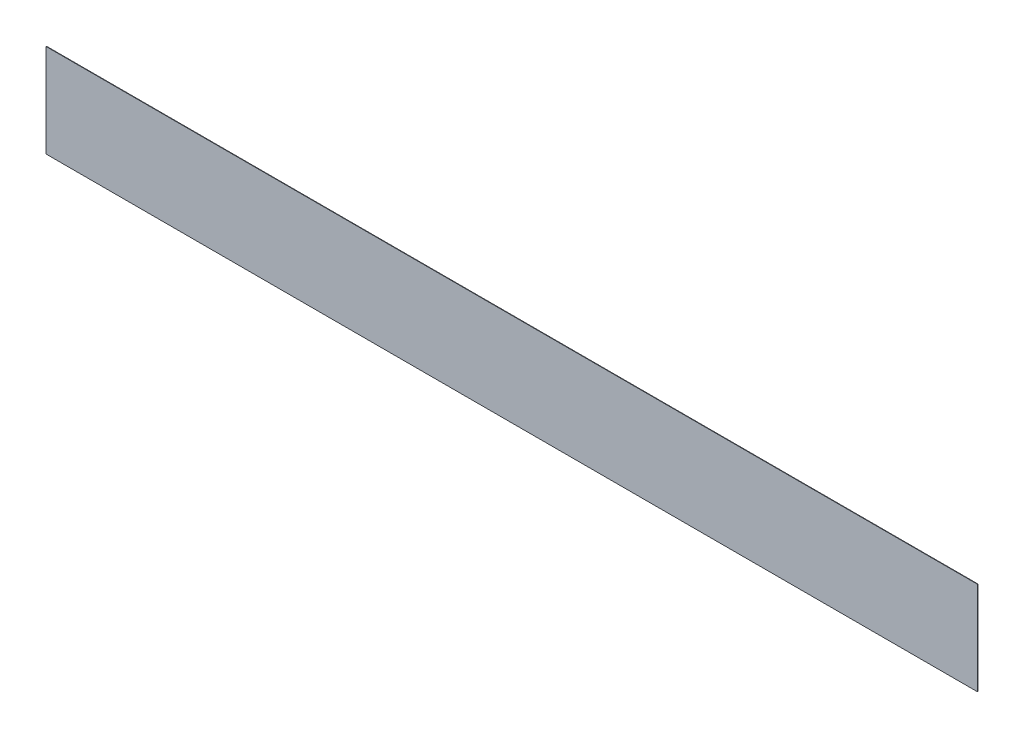
ISO-10303-21;
HEADER;
FILE_DESCRIPTION(('STEP AP214'),'2;1');
FILE_NAME('part.step','',(''),(''),'','','');
FILE_SCHEMA(('AUTOMOTIVE_DESIGN { 1 0 10303 214 1 1 1 1 }'));
ENDSEC;
DATA;
#1=APPLICATION_CONTEXT('core data for automotive mechanical design processes');
#2=APPLICATION_PROTOCOL_DEFINITION('international standard','automotive_design',2000,#1);
#3=PRODUCT_CONTEXT('',#1,'mechanical');
#4=PRODUCT('Part','Part','',(#3));
#5=PRODUCT_RELATED_PRODUCT_CATEGORY('part','',(#4));
#6=PRODUCT_DEFINITION_FORMATION('','',#4);
#7=PRODUCT_DEFINITION_CONTEXT('part definition',#1,'design');
#8=PRODUCT_DEFINITION('design','',#6,#7);
#9=PRODUCT_DEFINITION_SHAPE('','',#8);
#10=(LENGTH_UNIT() NAMED_UNIT(*) SI_UNIT(.MILLI.,.METRE.));
#11=(NAMED_UNIT(*) PLANE_ANGLE_UNIT() SI_UNIT($,.RADIAN.));
#12=(NAMED_UNIT(*) SI_UNIT($,.STERADIAN.) SOLID_ANGLE_UNIT());
#13=UNCERTAINTY_MEASURE_WITH_UNIT(LENGTH_MEASURE(1.E-05),#10,'distance_accuracy_value','');
#14=(GEOMETRIC_REPRESENTATION_CONTEXT(3) GLOBAL_UNCERTAINTY_ASSIGNED_CONTEXT((#13)) GLOBAL_UNIT_ASSIGNED_CONTEXT((#10,
#11,#12)) REPRESENTATION_CONTEXT('',''));
#15=CARTESIAN_POINT('',(0.,0.,0.));
#16=DIRECTION('',(0.,0.,1.));
#17=DIRECTION('',(1.,0.,0.));
#18=AXIS2_PLACEMENT_3D('',#15,#16,#17);
#19=CARTESIAN_POINT('',(-2000.,2000.,-20.));
#20=DIRECTION('',(-1.,0.,0.));
#21=DIRECTION('',(0.,-1.,0.));
#22=AXIS2_PLACEMENT_3D('',#19,#20,#21);
#23=PLANE('',#22);
#24=DIRECTION('',(0.,-1.,0.));
#25=VECTOR('',#24,1.);
#26=CARTESIAN_POINT('',(-2000.,2000.,0.));
#27=LINE('',#26,#25);
#28=CARTESIAN_POINT('',(-2000.,2000.,0.));
#29=VERTEX_POINT('',#28);
#30=CARTESIAN_POINT('',(-2000.,-2000.,0.));
#31=VERTEX_POINT('',#30);
#32=EDGE_CURVE('E113',#29,#31,#27,.T.);
#33=ORIENTED_EDGE('',*,*,#32,.F.);
#34=DIRECTION('',(0.,0.,1.));
#35=VECTOR('',#34,1.);
#36=CARTESIAN_POINT('',(-2000.,2000.,-20.));
#37=LINE('',#36,#35);
#38=CARTESIAN_POINT('',(-2000.,2000.,-20.));
#39=VERTEX_POINT('',#38);
#40=EDGE_CURVE('E11',#39,#29,#37,.T.);
#41=ORIENTED_EDGE('',*,*,#40,.F.);
#42=DIRECTION('',(0.,-1.,0.));
#43=VECTOR('',#42,1.);
#44=CARTESIAN_POINT('',(-2000.,2000.,-20.));
#45=LINE('',#44,#43);
#46=CARTESIAN_POINT('',(-2000.,-2000.,-20.));
#47=VERTEX_POINT('',#46);
#48=EDGE_CURVE('E105',#39,#47,#45,.T.);
#49=ORIENTED_EDGE('',*,*,#48,.T.);
#50=DIRECTION('',(0.,0.,1.));
#51=VECTOR('',#50,1.);
#52=CARTESIAN_POINT('',(-2000.,-2000.,-20.));
#53=LINE('',#52,#51);
#54=EDGE_CURVE('E46',#47,#31,#53,.T.);
#55=ORIENTED_EDGE('',*,*,#54,.T.);
#56=EDGE_LOOP('',(#33,#41,#49,#55));
#57=FACE_BOUND('',#56,.T.);
#58=ADVANCED_FACE('F43',(#57),#23,.T.);
#59=CARTESIAN_POINT('',(-2000.,2000.,-20.));
#60=DIRECTION('',(0.,1.,0.));
#61=DIRECTION('',(0.,0.,1.));
#62=AXIS2_PLACEMENT_3D('',#59,#60,#61);
#63=PLANE('',#62);
#64=DIRECTION('',(-1.,0.,0.));
#65=VECTOR('',#64,1.);
#66=CARTESIAN_POINT('',(-2000.,2000.,0.));
#67=LINE('',#66,#65);
#68=CARTESIAN_POINT('',(38000.,2000.,0.));
#69=VERTEX_POINT('',#68);
#70=EDGE_CURVE('E108',#69,#29,#67,.T.);
#71=ORIENTED_EDGE('',*,*,#70,.F.);
#72=DIRECTION('',(0.,0.,1.));
#73=VECTOR('',#72,1.);
#74=CARTESIAN_POINT('',(38000.,2000.,-20.));
#75=LINE('',#74,#73);
#76=CARTESIAN_POINT('',(38000.,2000.,-20.));
#77=VERTEX_POINT('',#76);
#78=EDGE_CURVE('E53',#77,#69,#75,.T.);
#79=ORIENTED_EDGE('',*,*,#78,.F.);
#80=DIRECTION('',(-1.,0.,0.));
#81=VECTOR('',#80,1.);
#82=CARTESIAN_POINT('',(-2000.,2000.,-20.));
#83=LINE('',#82,#81);
#84=EDGE_CURVE('E100',#77,#39,#83,.T.);
#85=ORIENTED_EDGE('',*,*,#84,.T.);
#86=ORIENTED_EDGE('',*,*,#40,.T.);
#87=EDGE_LOOP('',(#71,#79,#85,#86));
#88=FACE_BOUND('',#87,.T.);
#89=ADVANCED_FACE('F129',(#88),#63,.T.);
#90=CARTESIAN_POINT('',(38000.,2000.,-20.));
#91=DIRECTION('',(1.,0.,0.));
#92=DIRECTION('',(0.,0.,-1.));
#93=AXIS2_PLACEMENT_3D('',#90,#91,#92);
#94=PLANE('',#93);
#95=DIRECTION('',(0.,1.,0.));
#96=VECTOR('',#95,1.);
#97=CARTESIAN_POINT('',(38000.,2000.,0.));
#98=LINE('',#97,#96);
#99=CARTESIAN_POINT('',(38000.,-2000.,0.));
#100=VERTEX_POINT('',#99);
#101=EDGE_CURVE('E94',#100,#69,#98,.T.);
#102=ORIENTED_EDGE('',*,*,#101,.F.);
#103=DIRECTION('',(0.,0.,1.));
#104=VECTOR('',#103,1.);
#105=CARTESIAN_POINT('',(38000.,-2000.,-20.));
#106=LINE('',#105,#104);
#107=CARTESIAN_POINT('',(38000.,-2000.,-20.));
#108=VERTEX_POINT('',#107);
#109=EDGE_CURVE('E89',#108,#100,#106,.T.);
#110=ORIENTED_EDGE('',*,*,#109,.F.);
#111=DIRECTION('',(0.,1.,0.));
#112=VECTOR('',#111,1.);
#113=CARTESIAN_POINT('',(38000.,2000.,-20.));
#114=LINE('',#113,#112);
#115=EDGE_CURVE('E92',#108,#77,#114,.T.);
#116=ORIENTED_EDGE('',*,*,#115,.T.);
#117=ORIENTED_EDGE('',*,*,#78,.T.);
#118=EDGE_LOOP('',(#102,#110,#116,#117));
#119=FACE_BOUND('',#118,.T.);
#120=ADVANCED_FACE('F91',(#119),#94,.T.);
#121=CARTESIAN_POINT('',(-2000.,-2000.,-20.));
#122=DIRECTION('',(0.,-1.,0.));
#123=DIRECTION('',(0.,0.,-1.));
#124=AXIS2_PLACEMENT_3D('',#121,#122,#123);
#125=PLANE('',#124);
#126=DIRECTION('',(1.,0.,0.));
#127=VECTOR('',#126,1.);
#128=CARTESIAN_POINT('',(-2000.,-2000.,0.));
#129=LINE('',#128,#127);
#130=EDGE_CURVE('E117',#31,#100,#129,.T.);
#131=ORIENTED_EDGE('',*,*,#130,.F.);
#132=ORIENTED_EDGE('',*,*,#54,.F.);
#133=DIRECTION('',(1.,0.,0.));
#134=VECTOR('',#133,1.);
#135=CARTESIAN_POINT('',(-2000.,-2000.,-20.));
#136=LINE('',#135,#134);
#137=EDGE_CURVE('E99',#47,#108,#136,.T.);
#138=ORIENTED_EDGE('',*,*,#137,.T.);
#139=ORIENTED_EDGE('',*,*,#109,.T.);
#140=EDGE_LOOP('',(#131,#132,#138,#139));
#141=FACE_BOUND('',#140,.T.);
#142=ADVANCED_FACE('F103',(#141),#125,.T.);
#143=CARTESIAN_POINT('',(0.,0.,-20.));
#144=DIRECTION('',(0.,0.,1.));
#145=DIRECTION('',(1.,0.,0.));
#146=AXIS2_PLACEMENT_3D('',#143,#144,#145);
#147=PLANE('',#146);
#148=ORIENTED_EDGE('',*,*,#48,.F.);
#149=ORIENTED_EDGE('',*,*,#84,.F.);
#150=ORIENTED_EDGE('',*,*,#115,.F.);
#151=ORIENTED_EDGE('',*,*,#137,.F.);
#152=EDGE_LOOP('',(#148,#149,#150,#151));
#153=FACE_BOUND('',#152,.T.);
#154=ADVANCED_FACE('F98',(#153),#147,.F.);
#155=CARTESIAN_POINT('',(0.,0.,0.));
#156=DIRECTION('',(0.,0.,1.));
#157=DIRECTION('',(1.,0.,0.));
#158=AXIS2_PLACEMENT_3D('',#155,#156,#157);
#159=PLANE('',#158);
#160=ORIENTED_EDGE('',*,*,#32,.T.);
#161=ORIENTED_EDGE('',*,*,#130,.T.);
#162=ORIENTED_EDGE('',*,*,#101,.T.);
#163=ORIENTED_EDGE('',*,*,#70,.T.);
#164=EDGE_LOOP('',(#160,#161,#162,#163));
#165=FACE_BOUND('',#164,.T.);
#166=ADVANCED_FACE('F128',(#165),#159,.T.);
#167=CLOSED_SHELL('',(#58,#89,#120,#142,#154,#166));
#168=MANIFOLD_SOLID_BREP('B2',#167);
#169=ADVANCED_BREP_SHAPE_REPRESENTATION('',(#18,#168),#14);
#170=SHAPE_DEFINITION_REPRESENTATION(#9,#169);
ENDSEC;
END-ISO-10303-21;
